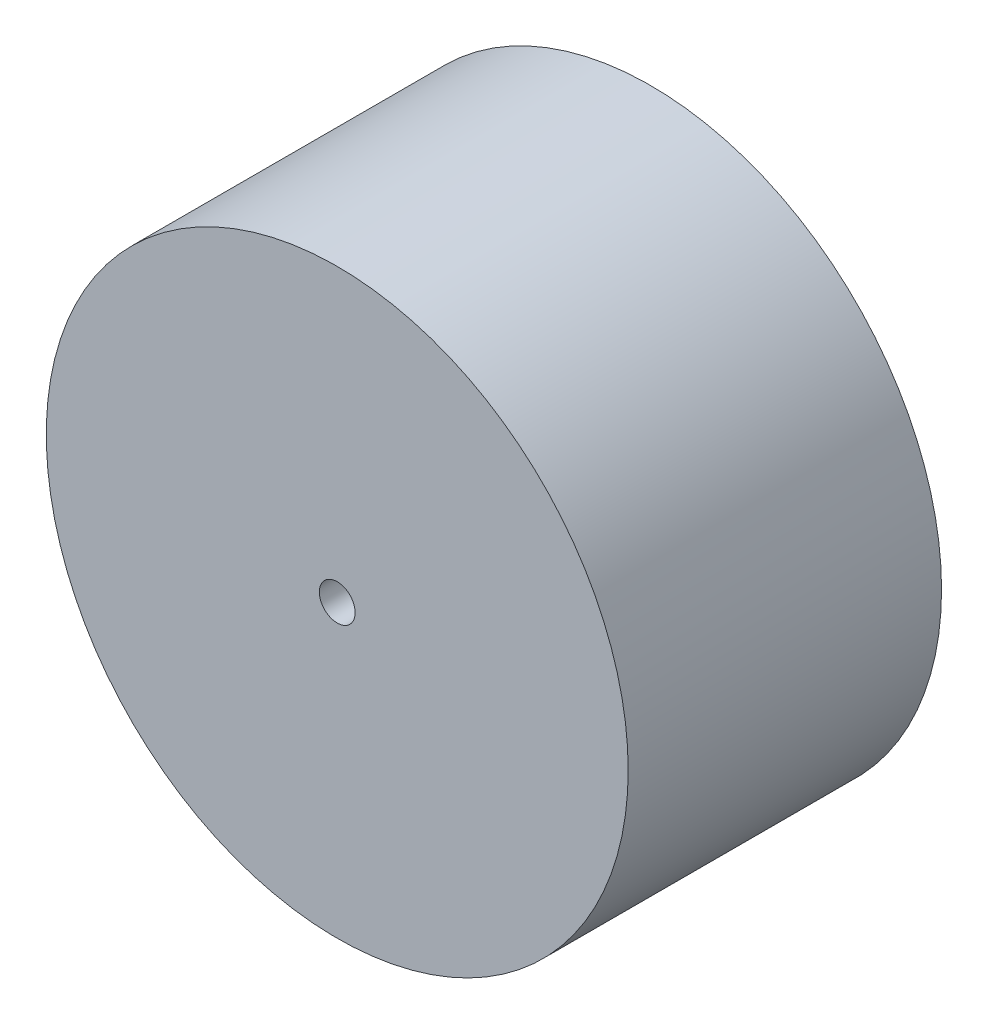
ISO-10303-21;
HEADER;
FILE_DESCRIPTION(('STEP AP214'),'2;1');
FILE_NAME('part.step','',(''),(''),'','','');
FILE_SCHEMA(('AUTOMOTIVE_DESIGN { 1 0 10303 214 1 1 1 1 }'));
ENDSEC;
DATA;
#1=APPLICATION_CONTEXT('core data for automotive mechanical design processes');
#2=APPLICATION_PROTOCOL_DEFINITION('international standard','automotive_design',2000,#1);
#3=PRODUCT_CONTEXT('',#1,'mechanical');
#4=PRODUCT('Part','Part','',(#3));
#5=PRODUCT_RELATED_PRODUCT_CATEGORY('part','',(#4));
#6=PRODUCT_DEFINITION_FORMATION('','',#4);
#7=PRODUCT_DEFINITION_CONTEXT('part definition',#1,'design');
#8=PRODUCT_DEFINITION('design','',#6,#7);
#9=PRODUCT_DEFINITION_SHAPE('','',#8);
#10=(LENGTH_UNIT() NAMED_UNIT(*) SI_UNIT(.MILLI.,.METRE.));
#11=(NAMED_UNIT(*) PLANE_ANGLE_UNIT() SI_UNIT($,.RADIAN.));
#12=(NAMED_UNIT(*) SI_UNIT($,.STERADIAN.) SOLID_ANGLE_UNIT());
#13=UNCERTAINTY_MEASURE_WITH_UNIT(LENGTH_MEASURE(1.E-05),#10,'distance_accuracy_value','');
#14=(GEOMETRIC_REPRESENTATION_CONTEXT(3) GLOBAL_UNCERTAINTY_ASSIGNED_CONTEXT((#13)) GLOBAL_UNIT_ASSIGNED_CONTEXT((#10,
#11,#12)) REPRESENTATION_CONTEXT('',''));
#15=CARTESIAN_POINT('',(0.,0.,0.));
#16=DIRECTION('',(0.,0.,1.));
#17=DIRECTION('',(1.,0.,0.));
#18=AXIS2_PLACEMENT_3D('',#15,#16,#17);
#19=CARTESIAN_POINT('',(0.,0.,35.));
#20=DIRECTION('',(0.,0.,1.));
#21=DIRECTION('',(1.,0.,0.));
#22=AXIS2_PLACEMENT_3D('',#19,#20,#21);
#23=PLANE('',#22);
#24=CARTESIAN_POINT('',(0.,0.,35.));
#25=DIRECTION('',(0.,0.,1.));
#26=DIRECTION('',(1.,0.,0.));
#27=AXIS2_PLACEMENT_3D('',#24,#25,#26);
#28=CIRCLE('',#27,32.5);
#29=CARTESIAN_POINT('',(32.5,0.,35.));
#30=VERTEX_POINT('',#29);
#31=EDGE_CURVE('E10',#30,#30,#28,.T.);
#32=ORIENTED_EDGE('',*,*,#31,.T.);
#33=EDGE_LOOP('',(#32));
#34=FACE_BOUND('',#33,.T.);
#35=CARTESIAN_POINT('',(0.,0.,35.));
#36=DIRECTION('',(0.,0.,1.));
#37=DIRECTION('',(1.,0.,0.));
#38=AXIS2_PLACEMENT_3D('',#35,#36,#37);
#39=CIRCLE('',#38,2.);
#40=CARTESIAN_POINT('',(2.,0.,35.));
#41=VERTEX_POINT('',#40);
#42=EDGE_CURVE('E56',#41,#41,#39,.T.);
#43=ORIENTED_EDGE('',*,*,#42,.F.);
#44=EDGE_LOOP('',(#43));
#45=FACE_BOUND('',#44,.T.);
#46=ADVANCED_FACE('F43',(#34,#45),#23,.T.);
#47=CARTESIAN_POINT('',(0.,0.,0.));
#48=DIRECTION('',(0.,0.,1.));
#49=DIRECTION('',(1.,0.,0.));
#50=AXIS2_PLACEMENT_3D('',#47,#48,#49);
#51=PLANE('',#50);
#52=CARTESIAN_POINT('',(0.,0.,0.));
#53=DIRECTION('',(0.,0.,1.));
#54=DIRECTION('',(1.,0.,0.));
#55=AXIS2_PLACEMENT_3D('',#52,#53,#54);
#56=CIRCLE('',#55,32.5);
#57=CARTESIAN_POINT('',(32.5,0.,0.));
#58=VERTEX_POINT('',#57);
#59=EDGE_CURVE('E47',#58,#58,#56,.T.);
#60=ORIENTED_EDGE('',*,*,#59,.F.);
#61=EDGE_LOOP('',(#60));
#62=FACE_BOUND('',#61,.T.);
#63=CARTESIAN_POINT('',(0.,0.,0.));
#64=DIRECTION('',(0.,0.,1.));
#65=DIRECTION('',(1.,0.,0.));
#66=AXIS2_PLACEMENT_3D('',#63,#64,#65);
#67=CIRCLE('',#66,2.);
#68=CARTESIAN_POINT('',(2.,0.,0.));
#69=VERTEX_POINT('',#68);
#70=EDGE_CURVE('E58',#69,#69,#67,.T.);
#71=ORIENTED_EDGE('',*,*,#70,.T.);
#72=EDGE_LOOP('',(#71));
#73=FACE_BOUND('',#72,.T.);
#74=ADVANCED_FACE('F70',(#62,#73),#51,.F.);
#75=CARTESIAN_POINT('',(0.,0.,35.));
#76=DIRECTION('',(0.,0.,-1.));
#77=DIRECTION('',(-1.,0.,0.));
#78=AXIS2_PLACEMENT_3D('',#75,#76,#77);
#79=CYLINDRICAL_SURFACE('',#78,32.5);
#80=ORIENTED_EDGE('',*,*,#31,.F.);
#81=EDGE_LOOP('',(#80));
#82=FACE_BOUND('',#81,.T.);
#83=ORIENTED_EDGE('',*,*,#59,.T.);
#84=EDGE_LOOP('',(#83));
#85=FACE_BOUND('',#84,.T.);
#86=ADVANCED_FACE('F45',(#82,#85),#79,.T.);
#87=CARTESIAN_POINT('',(0.,0.,35.));
#88=DIRECTION('',(0.,0.,-1.));
#89=DIRECTION('',(-1.,0.,0.));
#90=AXIS2_PLACEMENT_3D('',#87,#88,#89);
#91=CYLINDRICAL_SURFACE('',#90,2.);
#92=ORIENTED_EDGE('',*,*,#42,.T.);
#93=EDGE_LOOP('',(#92));
#94=FACE_BOUND('',#93,.T.);
#95=ORIENTED_EDGE('',*,*,#70,.F.);
#96=EDGE_LOOP('',(#95));
#97=FACE_BOUND('',#96,.T.);
#98=ADVANCED_FACE('F66',(#94,#97),#91,.F.);
#99=CLOSED_SHELL('',(#46,#74,#86,#98));
#100=MANIFOLD_SOLID_BREP('B2',#99);
#101=ADVANCED_BREP_SHAPE_REPRESENTATION('',(#18,#100),#14);
#102=SHAPE_DEFINITION_REPRESENTATION(#9,#101);
ENDSEC;
END-ISO-10303-21;
